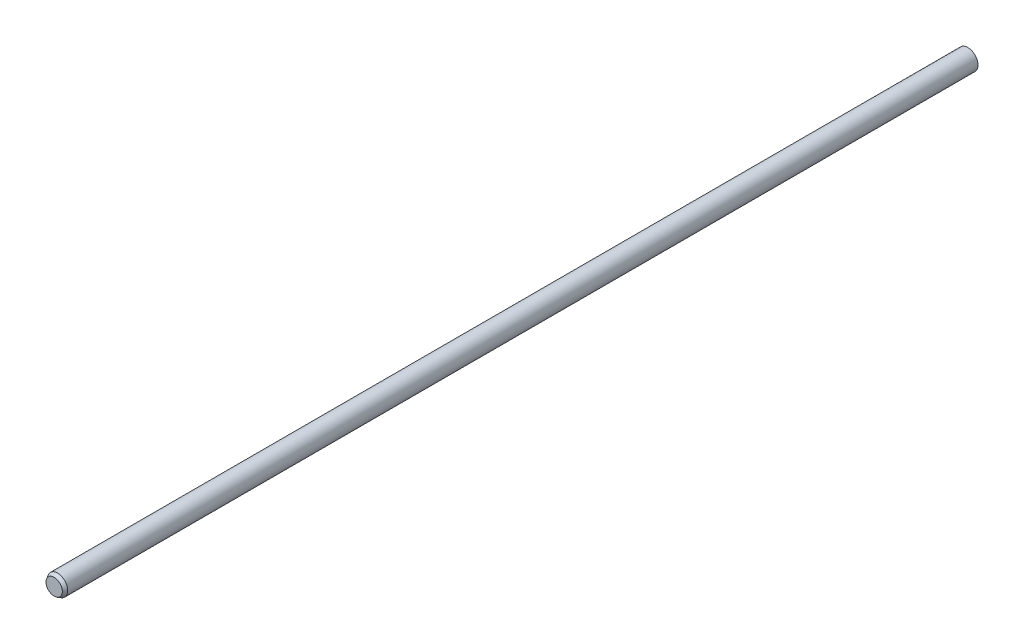
ISO-10303-21;
HEADER;
FILE_DESCRIPTION(('STEP AP214'),'2;1');
FILE_NAME('part.step','',(''),(''),'','','');
FILE_SCHEMA(('AUTOMOTIVE_DESIGN { 1 0 10303 214 1 1 1 1 }'));
ENDSEC;
DATA;
#1=APPLICATION_CONTEXT('core data for automotive mechanical design processes');
#2=APPLICATION_PROTOCOL_DEFINITION('international standard','automotive_design',2000,#1);
#3=PRODUCT_CONTEXT('',#1,'mechanical');
#4=PRODUCT('Part','Part','',(#3));
#5=PRODUCT_RELATED_PRODUCT_CATEGORY('part','',(#4));
#6=PRODUCT_DEFINITION_FORMATION('','',#4);
#7=PRODUCT_DEFINITION_CONTEXT('part definition',#1,'design');
#8=PRODUCT_DEFINITION('design','',#6,#7);
#9=PRODUCT_DEFINITION_SHAPE('','',#8);
#10=(LENGTH_UNIT() NAMED_UNIT(*) SI_UNIT(.MILLI.,.METRE.));
#11=(NAMED_UNIT(*) PLANE_ANGLE_UNIT() SI_UNIT($,.RADIAN.));
#12=(NAMED_UNIT(*) SI_UNIT($,.STERADIAN.) SOLID_ANGLE_UNIT());
#13=UNCERTAINTY_MEASURE_WITH_UNIT(LENGTH_MEASURE(1.E-05),#10,'distance_accuracy_value','');
#14=(GEOMETRIC_REPRESENTATION_CONTEXT(3) GLOBAL_UNCERTAINTY_ASSIGNED_CONTEXT((#13)) GLOBAL_UNIT_ASSIGNED_CONTEXT((#10,
#11,#12)) REPRESENTATION_CONTEXT('',''));
#15=CARTESIAN_POINT('',(0.,0.,0.));
#16=DIRECTION('',(0.,0.,1.));
#17=DIRECTION('',(1.,0.,0.));
#18=AXIS2_PLACEMENT_3D('',#15,#16,#17);
#19=CARTESIAN_POINT('',(0.,0.,271.));
#20=DIRECTION('',(0.,0.,-1.));
#21=DIRECTION('',(-1.,0.,0.));
#22=AXIS2_PLACEMENT_3D('',#19,#20,#21);
#23=CYLINDRICAL_SURFACE('',#22,3.);
#24=CARTESIAN_POINT('',(0.,0.,0.577350269189647));
#25=DIRECTION('',(0.,0.,1.));
#26=DIRECTION('',(1.,0.,0.));
#27=AXIS2_PLACEMENT_3D('',#24,#25,#26);
#28=CIRCLE('',#27,3.);
#29=CARTESIAN_POINT('',(3.,0.,0.577350269189647));
#30=VERTEX_POINT('',#29);
#31=EDGE_CURVE('E48',#30,#30,#28,.T.);
#32=ORIENTED_EDGE('',*,*,#31,.T.);
#33=EDGE_LOOP('',(#32));
#34=FACE_BOUND('',#33,.T.);
#35=CARTESIAN_POINT('',(0.,0.,270.));
#36=DIRECTION('',(0.,0.,1.));
#37=DIRECTION('',(1.,0.,0.));
#38=AXIS2_PLACEMENT_3D('',#35,#36,#37);
#39=CIRCLE('',#38,3.);
#40=CARTESIAN_POINT('',(3.,0.,270.));
#41=VERTEX_POINT('',#40);
#42=EDGE_CURVE('E55',#41,#41,#39,.F.);
#43=ORIENTED_EDGE('',*,*,#42,.T.);
#44=EDGE_LOOP('',(#43));
#45=FACE_BOUND('',#44,.T.);
#46=ADVANCED_FACE('F40',(#34,#45),#23,.T.);
#47=CARTESIAN_POINT('',(0.,0.,271.));
#48=DIRECTION('',(0.,0.,1.));
#49=DIRECTION('',(1.,0.,0.));
#50=AXIS2_PLACEMENT_3D('',#47,#48,#49);
#51=PLANE('',#50);
#52=CARTESIAN_POINT('',(0.,0.,271.));
#53=DIRECTION('',(0.,0.,1.));
#54=DIRECTION('',(1.,0.,0.));
#55=AXIS2_PLACEMENT_3D('',#52,#53,#54);
#56=CIRCLE('',#55,2.42264973081041);
#57=CARTESIAN_POINT('',(2.42264973081041,0.,271.));
#58=VERTEX_POINT('',#57);
#59=EDGE_CURVE('E10',#58,#58,#56,.T.);
#60=ORIENTED_EDGE('',*,*,#59,.T.);
#61=EDGE_LOOP('',(#60));
#62=FACE_BOUND('',#61,.T.);
#63=ADVANCED_FACE('F67',(#62),#51,.T.);
#64=CARTESIAN_POINT('',(0.,0.,0.));
#65=DIRECTION('',(0.,0.,1.));
#66=DIRECTION('',(1.,0.,0.));
#67=AXIS2_PLACEMENT_3D('',#64,#65,#66);
#68=PLANE('',#67);
#69=CARTESIAN_POINT('',(0.,0.,0.));
#70=DIRECTION('',(0.,0.,1.));
#71=DIRECTION('',(1.,0.,0.));
#72=AXIS2_PLACEMENT_3D('',#69,#70,#71);
#73=CIRCLE('',#72,1.99999999999997);
#74=CARTESIAN_POINT('',(1.99999999999997,0.,0.));
#75=VERTEX_POINT('',#74);
#76=EDGE_CURVE('E42',#75,#75,#73,.F.);
#77=ORIENTED_EDGE('',*,*,#76,.T.);
#78=EDGE_LOOP('',(#77));
#79=FACE_BOUND('',#78,.T.);
#80=ADVANCED_FACE('F63',(#79),#68,.F.);
#81=CARTESIAN_POINT('',(0.,0.,0.577350269189647));
#82=DIRECTION('',(0.,0.,1.));
#83=DIRECTION('',(1.,0.,0.));
#84=AXIS2_PLACEMENT_3D('',#81,#82,#83);
#85=CONICAL_SURFACE('',#84,3.,1.04719755119659);
#86=ORIENTED_EDGE('',*,*,#76,.F.);
#87=EDGE_LOOP('',(#86));
#88=FACE_BOUND('',#87,.T.);
#89=ORIENTED_EDGE('',*,*,#31,.F.);
#90=EDGE_LOOP('',(#89));
#91=FACE_BOUND('',#90,.T.);
#92=ADVANCED_FACE('F62',(#88,#91),#85,.T.);
#93=CARTESIAN_POINT('',(0.,0.,271.));
#94=DIRECTION('',(0.,0.,-1.));
#95=DIRECTION('',(-1.,0.,0.));
#96=AXIS2_PLACEMENT_3D('',#93,#94,#95);
#97=CONICAL_SURFACE('',#96,2.42264973081041,0.523598775598295);
#98=ORIENTED_EDGE('',*,*,#42,.F.);
#99=EDGE_LOOP('',(#98));
#100=FACE_BOUND('',#99,.T.);
#101=ORIENTED_EDGE('',*,*,#59,.F.);
#102=EDGE_LOOP('',(#101));
#103=FACE_BOUND('',#102,.T.);
#104=ADVANCED_FACE('F39',(#100,#103),#97,.T.);
#105=CLOSED_SHELL('',(#46,#63,#80,#92,#104));
#106=MANIFOLD_SOLID_BREP('B2',#105);
#107=ADVANCED_BREP_SHAPE_REPRESENTATION('',(#18,#106),#14);
#108=SHAPE_DEFINITION_REPRESENTATION(#9,#107);
ENDSEC;
END-ISO-10303-21;
